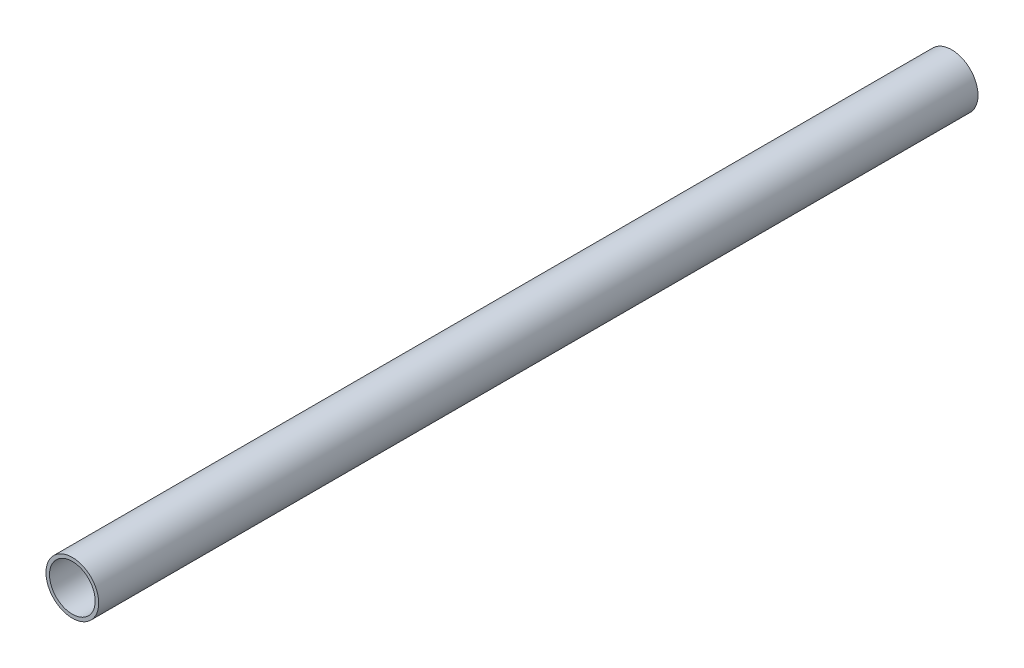
ISO-10303-21;
HEADER;
FILE_DESCRIPTION(('STEP AP214'),'2;1');
FILE_NAME('part.step','',(''),(''),'','','');
FILE_SCHEMA(('AUTOMOTIVE_DESIGN { 1 0 10303 214 1 1 1 1 }'));
ENDSEC;
DATA;
#1=APPLICATION_CONTEXT('core data for automotive mechanical design processes');
#2=APPLICATION_PROTOCOL_DEFINITION('international standard','automotive_design',2000,#1);
#3=PRODUCT_CONTEXT('',#1,'mechanical');
#4=PRODUCT('Part','Part','',(#3));
#5=PRODUCT_RELATED_PRODUCT_CATEGORY('part','',(#4));
#6=PRODUCT_DEFINITION_FORMATION('','',#4);
#7=PRODUCT_DEFINITION_CONTEXT('part definition',#1,'design');
#8=PRODUCT_DEFINITION('design','',#6,#7);
#9=PRODUCT_DEFINITION_SHAPE('','',#8);
#10=(LENGTH_UNIT() NAMED_UNIT(*) SI_UNIT(.MILLI.,.METRE.));
#11=(NAMED_UNIT(*) PLANE_ANGLE_UNIT() SI_UNIT($,.RADIAN.));
#12=(NAMED_UNIT(*) SI_UNIT($,.STERADIAN.) SOLID_ANGLE_UNIT());
#13=UNCERTAINTY_MEASURE_WITH_UNIT(LENGTH_MEASURE(1.E-05),#10,'distance_accuracy_value','');
#14=(GEOMETRIC_REPRESENTATION_CONTEXT(3) GLOBAL_UNCERTAINTY_ASSIGNED_CONTEXT((#13)) GLOBAL_UNIT_ASSIGNED_CONTEXT((#10,
#11,#12)) REPRESENTATION_CONTEXT('',''));
#15=CARTESIAN_POINT('',(0.,0.,0.));
#16=DIRECTION('',(0.,0.,1.));
#17=DIRECTION('',(1.,0.,0.));
#18=AXIS2_PLACEMENT_3D('',#15,#16,#17);
#19=CARTESIAN_POINT('',(0.,0.,50.));
#20=DIRECTION('',(0.,0.,1.));
#21=DIRECTION('',(1.,0.,0.));
#22=AXIS2_PLACEMENT_3D('',#19,#20,#21);
#23=PLANE('',#22);
#24=CARTESIAN_POINT('',(0.,0.,50.));
#25=DIRECTION('',(0.,0.,1.));
#26=DIRECTION('',(1.,0.,0.));
#27=AXIS2_PLACEMENT_3D('',#24,#25,#26);
#28=CIRCLE('',#27,1.5);
#29=CARTESIAN_POINT('',(1.5,0.,50.));
#30=VERTEX_POINT('',#29);
#31=EDGE_CURVE('E10',#30,#30,#28,.T.);
#32=ORIENTED_EDGE('',*,*,#31,.T.);
#33=EDGE_LOOP('',(#32));
#34=FACE_BOUND('',#33,.T.);
#35=CARTESIAN_POINT('',(0.,0.,50.));
#36=DIRECTION('',(0.,0.,1.));
#37=DIRECTION('',(1.,0.,0.));
#38=AXIS2_PLACEMENT_3D('',#35,#36,#37);
#39=CIRCLE('',#38,1.3);
#40=CARTESIAN_POINT('',(1.3,0.,50.));
#41=VERTEX_POINT('',#40);
#42=EDGE_CURVE('E45',#41,#41,#39,.T.);
#43=ORIENTED_EDGE('',*,*,#42,.F.);
#44=EDGE_LOOP('',(#43));
#45=FACE_BOUND('',#44,.T.);
#46=ADVANCED_FACE('F34',(#34,#45),#23,.T.);
#47=CARTESIAN_POINT('',(0.,0.,0.));
#48=DIRECTION('',(0.,0.,1.));
#49=DIRECTION('',(1.,0.,0.));
#50=AXIS2_PLACEMENT_3D('',#47,#48,#49);
#51=PLANE('',#50);
#52=CARTESIAN_POINT('',(0.,0.,0.));
#53=DIRECTION('',(0.,0.,1.));
#54=DIRECTION('',(1.,0.,0.));
#55=AXIS2_PLACEMENT_3D('',#52,#53,#54);
#56=CIRCLE('',#55,1.5);
#57=CARTESIAN_POINT('',(1.5,0.,0.));
#58=VERTEX_POINT('',#57);
#59=EDGE_CURVE('E38',#58,#58,#56,.T.);
#60=ORIENTED_EDGE('',*,*,#59,.F.);
#61=EDGE_LOOP('',(#60));
#62=FACE_BOUND('',#61,.T.);
#63=CARTESIAN_POINT('',(0.,0.,0.));
#64=DIRECTION('',(0.,0.,1.));
#65=DIRECTION('',(1.,0.,0.));
#66=AXIS2_PLACEMENT_3D('',#63,#64,#65);
#67=CIRCLE('',#66,1.3);
#68=CARTESIAN_POINT('',(1.3,0.,0.));
#69=VERTEX_POINT('',#68);
#70=EDGE_CURVE('E47',#69,#69,#67,.T.);
#71=ORIENTED_EDGE('',*,*,#70,.T.);
#72=EDGE_LOOP('',(#71));
#73=FACE_BOUND('',#72,.T.);
#74=ADVANCED_FACE('F57',(#62,#73),#51,.F.);
#75=CARTESIAN_POINT('',(0.,0.,50.));
#76=DIRECTION('',(0.,0.,-1.));
#77=DIRECTION('',(-1.,0.,0.));
#78=AXIS2_PLACEMENT_3D('',#75,#76,#77);
#79=CYLINDRICAL_SURFACE('',#78,1.5);
#80=ORIENTED_EDGE('',*,*,#31,.F.);
#81=EDGE_LOOP('',(#80));
#82=FACE_BOUND('',#81,.T.);
#83=ORIENTED_EDGE('',*,*,#59,.T.);
#84=EDGE_LOOP('',(#83));
#85=FACE_BOUND('',#84,.T.);
#86=ADVANCED_FACE('F36',(#82,#85),#79,.T.);
#87=CARTESIAN_POINT('',(0.,0.,50.));
#88=DIRECTION('',(0.,0.,-1.));
#89=DIRECTION('',(-1.,0.,0.));
#90=AXIS2_PLACEMENT_3D('',#87,#88,#89);
#91=CYLINDRICAL_SURFACE('',#90,1.3);
#92=ORIENTED_EDGE('',*,*,#42,.T.);
#93=EDGE_LOOP('',(#92));
#94=FACE_BOUND('',#93,.T.);
#95=ORIENTED_EDGE('',*,*,#70,.F.);
#96=EDGE_LOOP('',(#95));
#97=FACE_BOUND('',#96,.T.);
#98=ADVANCED_FACE('F53',(#94,#97),#91,.F.);
#99=CLOSED_SHELL('',(#46,#74,#86,#98));
#100=MANIFOLD_SOLID_BREP('B2',#99);
#101=ADVANCED_BREP_SHAPE_REPRESENTATION('',(#18,#100),#14);
#102=SHAPE_DEFINITION_REPRESENTATION(#9,#101);
ENDSEC;
END-ISO-10303-21;
